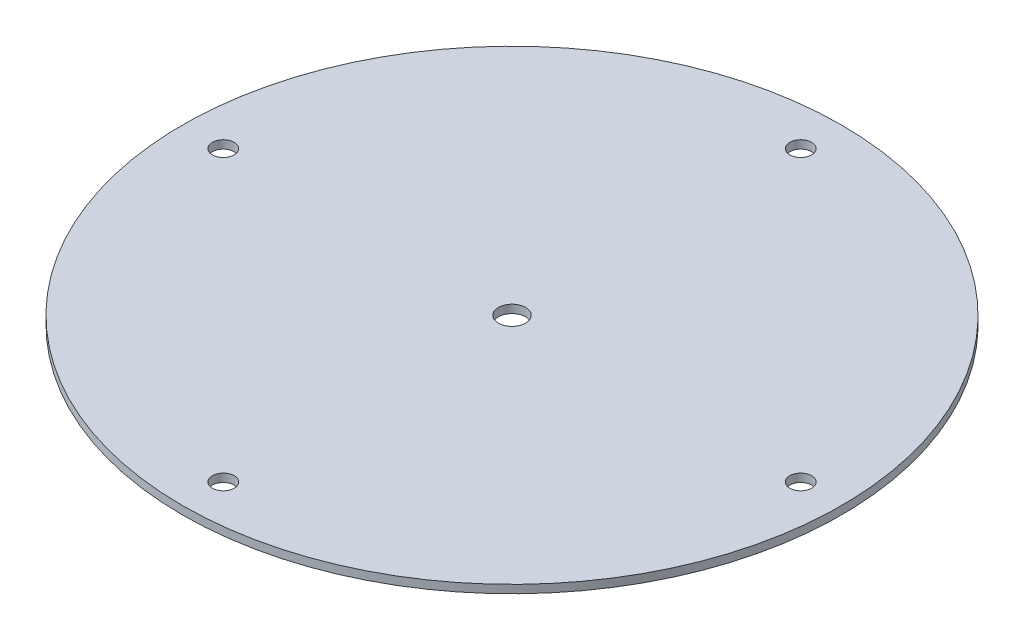
ISO-10303-21;
HEADER;
FILE_DESCRIPTION(('STEP AP214'),'2;1');
FILE_NAME('part.step','',(''),(''),'','','');
FILE_SCHEMA(('AUTOMOTIVE_DESIGN { 1 0 10303 214 1 1 1 1 }'));
ENDSEC;
DATA;
#1=APPLICATION_CONTEXT('core data for automotive mechanical design processes');
#2=APPLICATION_PROTOCOL_DEFINITION('international standard','automotive_design',2000,#1);
#3=PRODUCT_CONTEXT('',#1,'mechanical');
#4=PRODUCT('Part','Part','',(#3));
#5=PRODUCT_RELATED_PRODUCT_CATEGORY('part','',(#4));
#6=PRODUCT_DEFINITION_FORMATION('','',#4);
#7=PRODUCT_DEFINITION_CONTEXT('part definition',#1,'design');
#8=PRODUCT_DEFINITION('design','',#6,#7);
#9=PRODUCT_DEFINITION_SHAPE('','',#8);
#10=(LENGTH_UNIT() NAMED_UNIT(*) SI_UNIT(.MILLI.,.METRE.));
#11=(NAMED_UNIT(*) PLANE_ANGLE_UNIT() SI_UNIT($,.RADIAN.));
#12=(NAMED_UNIT(*) SI_UNIT($,.STERADIAN.) SOLID_ANGLE_UNIT());
#13=UNCERTAINTY_MEASURE_WITH_UNIT(LENGTH_MEASURE(1.E-05),#10,'distance_accuracy_value','');
#14=(GEOMETRIC_REPRESENTATION_CONTEXT(3) GLOBAL_UNCERTAINTY_ASSIGNED_CONTEXT((#13)) GLOBAL_UNIT_ASSIGNED_CONTEXT((#10,
#11,#12)) REPRESENTATION_CONTEXT('',''));
#15=CARTESIAN_POINT('',(0.,0.,0.));
#16=DIRECTION('',(0.,0.,1.));
#17=DIRECTION('',(1.,0.,0.));
#18=AXIS2_PLACEMENT_3D('',#15,#16,#17);
#19=CARTESIAN_POINT('',(0.,1.5,0.));
#20=DIRECTION('',(0.,1.,0.));
#21=DIRECTION('',(0.,0.,1.));
#22=AXIS2_PLACEMENT_3D('',#19,#20,#21);
#23=PLANE('',#22);
#24=CARTESIAN_POINT('',(-52.9999999999985,1.5,1.88293824976427E-12));
#25=DIRECTION('',(0.,1.,0.));
#26=DIRECTION('',(0.,0.,1.));
#27=AXIS2_PLACEMENT_3D('',#24,#25,#26);
#28=CIRCLE('',#27,2.00000000000242);
#29=CARTESIAN_POINT('',(-52.9999999999985,1.5,2.0000000000043));
#30=VERTEX_POINT('',#29);
#31=EDGE_CURVE('E68',#30,#30,#28,.T.);
#32=ORIENTED_EDGE('',*,*,#31,.F.);
#33=EDGE_LOOP('',(#32));
#34=FACE_BOUND('',#33,.T.);
#35=CARTESIAN_POINT('',(3.3827982215402E-12,1.5,53.));
#36=DIRECTION('',(0.,1.,0.));
#37=DIRECTION('',(0.,0.,1.));
#38=AXIS2_PLACEMENT_3D('',#35,#36,#37);
#39=CIRCLE('',#38,2.00000000000324);
#40=CARTESIAN_POINT('',(3.3827982215402E-12,1.5,55.0000000000032));
#41=VERTEX_POINT('',#40);
#42=EDGE_CURVE('E62',#41,#41,#39,.T.);
#43=ORIENTED_EDGE('',*,*,#42,.F.);
#44=EDGE_LOOP('',(#43));
#45=FACE_BOUND('',#44,.T.);
#46=CARTESIAN_POINT('',(53.0000000000015,1.5,-1.87644762172878E-12));
#47=DIRECTION('',(0.,1.,0.));
#48=DIRECTION('',(0.,0.,1.));
#49=AXIS2_PLACEMENT_3D('',#46,#47,#48);
#50=CIRCLE('',#49,2.00000000000117);
#51=CARTESIAN_POINT('',(53.0000000000015,1.5,1.9999999999993));
#52=VERTEX_POINT('',#51);
#53=EDGE_CURVE('E56',#52,#52,#50,.T.);
#54=ORIENTED_EDGE('',*,*,#53,.F.);
#55=EDGE_LOOP('',(#54));
#56=FACE_BOUND('',#55,.T.);
#57=CARTESIAN_POINT('',(-3.70097021917372E-13,1.5,-53.));
#58=DIRECTION('',(0.,1.,0.));
#59=DIRECTION('',(0.,0.,1.));
#60=AXIS2_PLACEMENT_3D('',#57,#58,#59);
#61=CIRCLE('',#60,2.);
#62=CARTESIAN_POINT('',(-3.70097021917372E-13,1.5,-51.));
#63=VERTEX_POINT('',#62);
#64=EDGE_CURVE('E50',#63,#63,#61,.T.);
#65=ORIENTED_EDGE('',*,*,#64,.F.);
#66=EDGE_LOOP('',(#65));
#67=FACE_BOUND('',#66,.T.);
#68=CARTESIAN_POINT('',(0.,1.5,0.));
#69=DIRECTION('',(0.,1.,0.));
#70=DIRECTION('',(0.,0.,1.));
#71=AXIS2_PLACEMENT_3D('',#68,#69,#70);
#72=CIRCLE('',#71,60.5);
#73=CARTESIAN_POINT('',(0.,1.5,60.5));
#74=VERTEX_POINT('',#73);
#75=EDGE_CURVE('E10',#74,#74,#72,.T.);
#76=ORIENTED_EDGE('',*,*,#75,.T.);
#77=EDGE_LOOP('',(#76));
#78=FACE_BOUND('',#77,.T.);
#79=CARTESIAN_POINT('',(0.,1.5,0.));
#80=DIRECTION('',(0.,1.,0.));
#81=DIRECTION('',(0.,0.,1.));
#82=AXIS2_PLACEMENT_3D('',#79,#80,#81);
#83=CIRCLE('',#82,2.5);
#84=CARTESIAN_POINT('',(0.,1.5,2.5));
#85=VERTEX_POINT('',#84);
#86=EDGE_CURVE('E42',#85,#85,#83,.T.);
#87=ORIENTED_EDGE('',*,*,#86,.F.);
#88=EDGE_LOOP('',(#87));
#89=FACE_BOUND('',#88,.T.);
#90=ADVANCED_FACE('F31',(#34,#45,#56,#67,#78,#89),#23,.T.);
#91=CARTESIAN_POINT('',(0.,0.,0.));
#92=DIRECTION('',(0.,1.,0.));
#93=DIRECTION('',(0.,0.,1.));
#94=AXIS2_PLACEMENT_3D('',#91,#92,#93);
#95=PLANE('',#94);
#96=CARTESIAN_POINT('',(-52.9999999999985,0.,1.88293824976427E-12));
#97=DIRECTION('',(0.,1.,0.));
#98=DIRECTION('',(0.,0.,1.));
#99=AXIS2_PLACEMENT_3D('',#96,#97,#98);
#100=CIRCLE('',#99,2.00000000000242);
#101=CARTESIAN_POINT('',(-52.9999999999985,0.,2.0000000000043));
#102=VERTEX_POINT('',#101);
#103=EDGE_CURVE('E65',#102,#102,#100,.T.);
#104=ORIENTED_EDGE('',*,*,#103,.T.);
#105=EDGE_LOOP('',(#104));
#106=FACE_BOUND('',#105,.T.);
#107=CARTESIAN_POINT('',(3.3827982215402E-12,0.,53.));
#108=DIRECTION('',(0.,1.,0.));
#109=DIRECTION('',(0.,0.,1.));
#110=AXIS2_PLACEMENT_3D('',#107,#108,#109);
#111=CIRCLE('',#110,2.00000000000324);
#112=CARTESIAN_POINT('',(3.3827982215402E-12,0.,55.0000000000032));
#113=VERTEX_POINT('',#112);
#114=EDGE_CURVE('E59',#113,#113,#111,.T.);
#115=ORIENTED_EDGE('',*,*,#114,.T.);
#116=EDGE_LOOP('',(#115));
#117=FACE_BOUND('',#116,.T.);
#118=CARTESIAN_POINT('',(53.0000000000015,0.,-1.87644762172878E-12));
#119=DIRECTION('',(0.,1.,0.));
#120=DIRECTION('',(0.,0.,1.));
#121=AXIS2_PLACEMENT_3D('',#118,#119,#120);
#122=CIRCLE('',#121,2.00000000000117);
#123=CARTESIAN_POINT('',(53.0000000000015,0.,1.9999999999993));
#124=VERTEX_POINT('',#123);
#125=EDGE_CURVE('E53',#124,#124,#122,.T.);
#126=ORIENTED_EDGE('',*,*,#125,.T.);
#127=EDGE_LOOP('',(#126));
#128=FACE_BOUND('',#127,.T.);
#129=CARTESIAN_POINT('',(-3.70097021917372E-13,0.,-53.));
#130=DIRECTION('',(0.,1.,0.));
#131=DIRECTION('',(0.,0.,1.));
#132=AXIS2_PLACEMENT_3D('',#129,#130,#131);
#133=CIRCLE('',#132,2.);
#134=CARTESIAN_POINT('',(-3.70097021917372E-13,0.,-51.));
#135=VERTEX_POINT('',#134);
#136=EDGE_CURVE('E47',#135,#135,#133,.T.);
#137=ORIENTED_EDGE('',*,*,#136,.T.);
#138=EDGE_LOOP('',(#137));
#139=FACE_BOUND('',#138,.T.);
#140=CARTESIAN_POINT('',(0.,0.,0.));
#141=DIRECTION('',(0.,1.,0.));
#142=DIRECTION('',(0.,0.,1.));
#143=AXIS2_PLACEMENT_3D('',#140,#141,#142);
#144=CIRCLE('',#143,60.5);
#145=CARTESIAN_POINT('',(0.,0.,60.5));
#146=VERTEX_POINT('',#145);
#147=EDGE_CURVE('E35',#146,#146,#144,.T.);
#148=ORIENTED_EDGE('',*,*,#147,.F.);
#149=EDGE_LOOP('',(#148));
#150=FACE_BOUND('',#149,.T.);
#151=CARTESIAN_POINT('',(0.,0.,0.));
#152=DIRECTION('',(0.,1.,0.));
#153=DIRECTION('',(0.,0.,1.));
#154=AXIS2_PLACEMENT_3D('',#151,#152,#153);
#155=CIRCLE('',#154,2.5);
#156=CARTESIAN_POINT('',(0.,0.,2.5));
#157=VERTEX_POINT('',#156);
#158=EDGE_CURVE('E44',#157,#157,#155,.T.);
#159=ORIENTED_EDGE('',*,*,#158,.T.);
#160=EDGE_LOOP('',(#159));
#161=FACE_BOUND('',#160,.T.);
#162=ADVANCED_FACE('F74',(#106,#117,#128,#139,#150,#161),#95,.F.);
#163=CARTESIAN_POINT('',(0.,1.5,0.));
#164=DIRECTION('',(0.,-1.,0.));
#165=DIRECTION('',(0.,0.,-1.));
#166=AXIS2_PLACEMENT_3D('',#163,#164,#165);
#167=CYLINDRICAL_SURFACE('',#166,60.5);
#168=ORIENTED_EDGE('',*,*,#75,.F.);
#169=EDGE_LOOP('',(#168));
#170=FACE_BOUND('',#169,.T.);
#171=ORIENTED_EDGE('',*,*,#147,.T.);
#172=EDGE_LOOP('',(#171));
#173=FACE_BOUND('',#172,.T.);
#174=ADVANCED_FACE('F33',(#170,#173),#167,.T.);
#175=CARTESIAN_POINT('',(0.,1.5,0.));
#176=DIRECTION('',(0.,-1.,0.));
#177=DIRECTION('',(0.,0.,-1.));
#178=AXIS2_PLACEMENT_3D('',#175,#176,#177);
#179=CYLINDRICAL_SURFACE('',#178,2.5);
#180=ORIENTED_EDGE('',*,*,#86,.T.);
#181=EDGE_LOOP('',(#180));
#182=FACE_BOUND('',#181,.T.);
#183=ORIENTED_EDGE('',*,*,#158,.F.);
#184=EDGE_LOOP('',(#183));
#185=FACE_BOUND('',#184,.T.);
#186=ADVANCED_FACE('F95',(#182,#185),#179,.F.);
#187=CARTESIAN_POINT('',(-3.70097021917372E-13,0.,-53.));
#188=DIRECTION('',(0.,1.,0.));
#189=DIRECTION('',(0.,0.,1.));
#190=AXIS2_PLACEMENT_3D('',#187,#188,#189);
#191=CYLINDRICAL_SURFACE('',#190,2.);
#192=ORIENTED_EDGE('',*,*,#136,.F.);
#193=EDGE_LOOP('',(#192));
#194=FACE_BOUND('',#193,.T.);
#195=ORIENTED_EDGE('',*,*,#64,.T.);
#196=EDGE_LOOP('',(#195));
#197=FACE_BOUND('',#196,.T.);
#198=ADVANCED_FACE('F98',(#194,#197),#191,.F.);
#199=CARTESIAN_POINT('',(53.0000000000015,0.,-1.87644762172878E-12));
#200=DIRECTION('',(0.,1.,0.));
#201=DIRECTION('',(0.,0.,1.));
#202=AXIS2_PLACEMENT_3D('',#199,#200,#201);
#203=CYLINDRICAL_SURFACE('',#202,2.00000000000117);
#204=ORIENTED_EDGE('',*,*,#125,.F.);
#205=EDGE_LOOP('',(#204));
#206=FACE_BOUND('',#205,.T.);
#207=ORIENTED_EDGE('',*,*,#53,.T.);
#208=EDGE_LOOP('',(#207));
#209=FACE_BOUND('',#208,.T.);
#210=ADVANCED_FACE('F111',(#206,#209),#203,.F.);
#211=CARTESIAN_POINT('',(3.3827982215402E-12,0.,53.));
#212=DIRECTION('',(0.,1.,0.));
#213=DIRECTION('',(0.,0.,1.));
#214=AXIS2_PLACEMENT_3D('',#211,#212,#213);
#215=CYLINDRICAL_SURFACE('',#214,2.00000000000324);
#216=ORIENTED_EDGE('',*,*,#114,.F.);
#217=EDGE_LOOP('',(#216));
#218=FACE_BOUND('',#217,.T.);
#219=ORIENTED_EDGE('',*,*,#42,.T.);
#220=EDGE_LOOP('',(#219));
#221=FACE_BOUND('',#220,.T.);
#222=ADVANCED_FACE('F80',(#218,#221),#215,.F.);
#223=CARTESIAN_POINT('',(-52.9999999999985,0.,1.88293824976427E-12));
#224=DIRECTION('',(0.,1.,0.));
#225=DIRECTION('',(0.,0.,1.));
#226=AXIS2_PLACEMENT_3D('',#223,#224,#225);
#227=CYLINDRICAL_SURFACE('',#226,2.00000000000242);
#228=ORIENTED_EDGE('',*,*,#103,.F.);
#229=EDGE_LOOP('',(#228));
#230=FACE_BOUND('',#229,.T.);
#231=ORIENTED_EDGE('',*,*,#31,.T.);
#232=EDGE_LOOP('',(#231));
#233=FACE_BOUND('',#232,.T.);
#234=ADVANCED_FACE('F77',(#230,#233),#227,.F.);
#235=CLOSED_SHELL('',(#90,#162,#174,#186,#198,#210,#222,#234));
#236=MANIFOLD_SOLID_BREP('B2',#235);
#237=ADVANCED_BREP_SHAPE_REPRESENTATION('',(#18,#236),#14);
#238=SHAPE_DEFINITION_REPRESENTATION(#9,#237);
ENDSEC;
END-ISO-10303-21;
